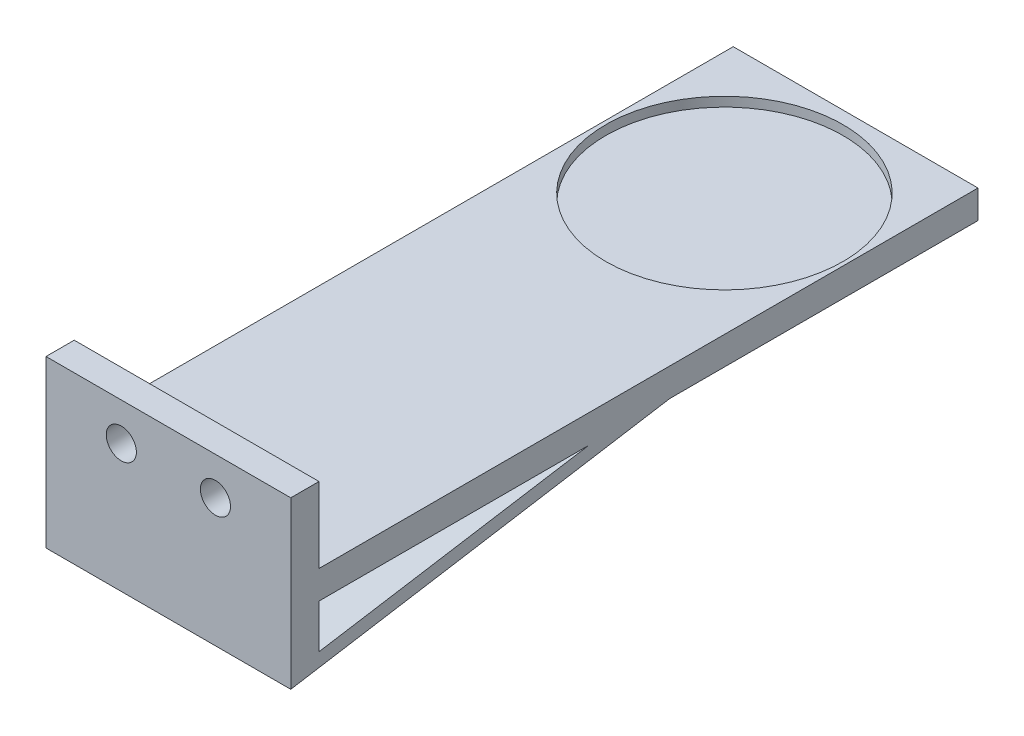
ISO-10303-21;
HEADER;
FILE_DESCRIPTION(('STEP AP214'),'2;1');
FILE_NAME('part.step','',(''),(''),'','','');
FILE_SCHEMA(('AUTOMOTIVE_DESIGN { 1 0 10303 214 1 1 1 1 }'));
ENDSEC;
DATA;
#1=APPLICATION_CONTEXT('core data for automotive mechanical design processes');
#2=APPLICATION_PROTOCOL_DEFINITION('international standard','automotive_design',2000,#1);
#3=PRODUCT_CONTEXT('',#1,'mechanical');
#4=PRODUCT('Part','Part','',(#3));
#5=PRODUCT_RELATED_PRODUCT_CATEGORY('part','',(#4));
#6=PRODUCT_DEFINITION_FORMATION('','',#4);
#7=PRODUCT_DEFINITION_CONTEXT('part definition',#1,'design');
#8=PRODUCT_DEFINITION('design','',#6,#7);
#9=PRODUCT_DEFINITION_SHAPE('','',#8);
#10=(LENGTH_UNIT() NAMED_UNIT(*) SI_UNIT(.MILLI.,.METRE.));
#11=(NAMED_UNIT(*) PLANE_ANGLE_UNIT() SI_UNIT($,.RADIAN.));
#12=(NAMED_UNIT(*) SI_UNIT($,.STERADIAN.) SOLID_ANGLE_UNIT());
#13=UNCERTAINTY_MEASURE_WITH_UNIT(LENGTH_MEASURE(1.E-05),#10,'distance_accuracy_value','');
#14=(GEOMETRIC_REPRESENTATION_CONTEXT(3) GLOBAL_UNCERTAINTY_ASSIGNED_CONTEXT((#13)) GLOBAL_UNIT_ASSIGNED_CONTEXT((#10,
#11,#12)) REPRESENTATION_CONTEXT('',''));
#15=CARTESIAN_POINT('',(0.,0.,0.));
#16=DIRECTION('',(0.,0.,1.));
#17=DIRECTION('',(1.,0.,0.));
#18=AXIS2_PLACEMENT_3D('',#15,#16,#17);
#19=CARTESIAN_POINT('',(26.,1.5,0.));
#20=DIRECTION('',(0.,1.,0.));
#21=DIRECTION('',(0.,0.,1.));
#22=AXIS2_PLACEMENT_3D('',#19,#20,#21);
#23=PLANE('',#22);
#24=CARTESIAN_POINT('',(13.,1.5,-22.5631650176297));
#25=DIRECTION('',(0.,1.,0.));
#26=DIRECTION('',(0.,0.,1.));
#27=AXIS2_PLACEMENT_3D('',#24,#25,#26);
#28=CIRCLE('',#27,12.6);
#29=CARTESIAN_POINT('',(13.,1.5,-9.96316501762967));
#30=VERTEX_POINT('',#29);
#31=EDGE_CURVE('E218',#30,#30,#28,.T.);
#32=ORIENTED_EDGE('',*,*,#31,.F.);
#33=EDGE_LOOP('',(#32));
#34=FACE_BOUND('',#33,.T.);
#35=DIRECTION('',(0.,0.,-1.));
#36=VECTOR('',#35,1.);
#37=CARTESIAN_POINT('',(0.,1.5,0.));
#38=LINE('',#37,#36);
#39=CARTESIAN_POINT('',(0.,1.5,33.5));
#40=VERTEX_POINT('',#39);
#41=CARTESIAN_POINT('',(0.,1.5,-36.5));
#42=VERTEX_POINT('',#41);
#43=EDGE_CURVE('E181',#40,#42,#38,.T.);
#44=ORIENTED_EDGE('',*,*,#43,.F.);
#45=DIRECTION('',(-1.,0.,0.));
#46=VECTOR('',#45,1.);
#47=CARTESIAN_POINT('',(26.,1.5,33.5));
#48=LINE('',#47,#46);
#49=CARTESIAN_POINT('',(26.,1.5,33.5));
#50=VERTEX_POINT('',#49);
#51=EDGE_CURVE('E11',#50,#40,#48,.T.);
#52=ORIENTED_EDGE('',*,*,#51,.F.);
#53=DIRECTION('',(0.,0.,-1.));
#54=VECTOR('',#53,1.);
#55=CARTESIAN_POINT('',(26.,1.5,0.));
#56=LINE('',#55,#54);
#57=CARTESIAN_POINT('',(26.,1.5,-36.5));
#58=VERTEX_POINT('',#57);
#59=EDGE_CURVE('E199',#50,#58,#56,.T.);
#60=ORIENTED_EDGE('',*,*,#59,.T.);
#61=DIRECTION('',(-1.,0.,0.));
#62=VECTOR('',#61,1.);
#63=CARTESIAN_POINT('',(26.,1.5,-36.5));
#64=LINE('',#63,#62);
#65=EDGE_CURVE('E98',#58,#42,#64,.T.);
#66=ORIENTED_EDGE('',*,*,#65,.T.);
#67=EDGE_LOOP('',(#44,#52,#60,#66));
#68=FACE_BOUND('',#67,.T.);
#69=ADVANCED_FACE('F39',(#34,#68),#23,.T.);
#70=CARTESIAN_POINT('',(26.,0.,33.5));
#71=DIRECTION('',(0.,0.,1.));
#72=DIRECTION('',(1.,0.,0.));
#73=AXIS2_PLACEMENT_3D('',#70,#71,#72);
#74=PLANE('',#73);
#75=CARTESIAN_POINT('',(18.,5.5,33.5));
#76=DIRECTION('',(0.,0.,1.));
#77=DIRECTION('',(1.,0.,0.));
#78=AXIS2_PLACEMENT_3D('',#75,#76,#77);
#79=CIRCLE('',#78,1.6);
#80=CARTESIAN_POINT('',(19.6,5.5,33.5));
#81=VERTEX_POINT('',#80);
#82=EDGE_CURVE('E211',#81,#81,#79,.T.);
#83=ORIENTED_EDGE('',*,*,#82,.T.);
#84=EDGE_LOOP('',(#83));
#85=FACE_BOUND('',#84,.T.);
#86=CARTESIAN_POINT('',(8.,5.5,33.5));
#87=DIRECTION('',(0.,0.,1.));
#88=DIRECTION('',(1.,0.,0.));
#89=AXIS2_PLACEMENT_3D('',#86,#87,#88);
#90=CIRCLE('',#89,1.6);
#91=CARTESIAN_POINT('',(9.6,5.5,33.5));
#92=VERTEX_POINT('',#91);
#93=EDGE_CURVE('E191',#92,#92,#90,.T.);
#94=ORIENTED_EDGE('',*,*,#93,.T.);
#95=EDGE_LOOP('',(#94));
#96=FACE_BOUND('',#95,.T.);
#97=DIRECTION('',(0.,1.,0.));
#98=VECTOR('',#97,1.);
#99=CARTESIAN_POINT('',(0.,0.,33.5));
#100=LINE('',#99,#98);
#101=CARTESIAN_POINT('',(0.,9.5,33.5));
#102=VERTEX_POINT('',#101);
#103=EDGE_CURVE('E178',#40,#102,#100,.T.);
#104=ORIENTED_EDGE('',*,*,#103,.T.);
#105=DIRECTION('',(-1.,0.,0.));
#106=VECTOR('',#105,1.);
#107=CARTESIAN_POINT('',(26.,9.5,33.5));
#108=LINE('',#107,#106);
#109=CARTESIAN_POINT('',(26.,9.5,33.5));
#110=VERTEX_POINT('',#109);
#111=EDGE_CURVE('E49',#110,#102,#108,.T.);
#112=ORIENTED_EDGE('',*,*,#111,.F.);
#113=DIRECTION('',(0.,1.,0.));
#114=VECTOR('',#113,1.);
#115=CARTESIAN_POINT('',(26.,0.,33.5));
#116=LINE('',#115,#114);
#117=EDGE_CURVE('E197',#50,#110,#116,.T.);
#118=ORIENTED_EDGE('',*,*,#117,.F.);
#119=ORIENTED_EDGE('',*,*,#51,.T.);
#120=EDGE_LOOP('',(#104,#112,#118,#119));
#121=FACE_BOUND('',#120,.T.);
#122=ADVANCED_FACE('F234',(#85,#96,#121),#74,.F.);
#123=CARTESIAN_POINT('',(26.,9.5,0.));
#124=DIRECTION('',(0.,1.,0.));
#125=DIRECTION('',(0.,0.,1.));
#126=AXIS2_PLACEMENT_3D('',#123,#124,#125);
#127=PLANE('',#126);
#128=DIRECTION('',(0.,0.,-1.));
#129=VECTOR('',#128,1.);
#130=CARTESIAN_POINT('',(0.,9.5,0.));
#131=LINE('',#130,#129);
#132=CARTESIAN_POINT('',(0.,9.5,36.5));
#133=VERTEX_POINT('',#132);
#134=EDGE_CURVE('E175',#133,#102,#131,.T.);
#135=ORIENTED_EDGE('',*,*,#134,.F.);
#136=DIRECTION('',(-1.,0.,0.));
#137=VECTOR('',#136,1.);
#138=CARTESIAN_POINT('',(26.,9.5,36.5));
#139=LINE('',#138,#137);
#140=CARTESIAN_POINT('',(26.,9.5,36.5));
#141=VERTEX_POINT('',#140);
#142=EDGE_CURVE('E150',#141,#133,#139,.T.);
#143=ORIENTED_EDGE('',*,*,#142,.F.);
#144=DIRECTION('',(0.,0.,-1.));
#145=VECTOR('',#144,1.);
#146=CARTESIAN_POINT('',(26.,9.5,0.));
#147=LINE('',#146,#145);
#148=EDGE_CURVE('E194',#141,#110,#147,.T.);
#149=ORIENTED_EDGE('',*,*,#148,.T.);
#150=ORIENTED_EDGE('',*,*,#111,.T.);
#151=EDGE_LOOP('',(#135,#143,#149,#150));
#152=FACE_BOUND('',#151,.T.);
#153=ADVANCED_FACE('F246',(#152),#127,.T.);
#154=CARTESIAN_POINT('',(26.,0.,36.5));
#155=DIRECTION('',(0.,0.,1.));
#156=DIRECTION('',(1.,0.,0.));
#157=AXIS2_PLACEMENT_3D('',#154,#155,#156);
#158=PLANE('',#157);
#159=CARTESIAN_POINT('',(18.,5.5,36.5));
#160=DIRECTION('',(0.,0.,1.));
#161=DIRECTION('',(1.,0.,0.));
#162=AXIS2_PLACEMENT_3D('',#159,#160,#161);
#163=CIRCLE('',#162,1.6);
#164=CARTESIAN_POINT('',(19.6,5.5,36.5));
#165=VERTEX_POINT('',#164);
#166=EDGE_CURVE('E214',#165,#165,#163,.T.);
#167=ORIENTED_EDGE('',*,*,#166,.F.);
#168=EDGE_LOOP('',(#167));
#169=FACE_BOUND('',#168,.T.);
#170=CARTESIAN_POINT('',(8.,5.5,36.5));
#171=DIRECTION('',(0.,0.,1.));
#172=DIRECTION('',(1.,0.,0.));
#173=AXIS2_PLACEMENT_3D('',#170,#171,#172);
#174=CIRCLE('',#173,1.6);
#175=CARTESIAN_POINT('',(9.6,5.5,36.5));
#176=VERTEX_POINT('',#175);
#177=EDGE_CURVE('E208',#176,#176,#174,.T.);
#178=ORIENTED_EDGE('',*,*,#177,.F.);
#179=EDGE_LOOP('',(#178));
#180=FACE_BOUND('',#179,.T.);
#181=DIRECTION('',(0.,1.,0.));
#182=VECTOR('',#181,1.);
#183=CARTESIAN_POINT('',(0.,0.,36.5));
#184=LINE('',#183,#182);
#185=CARTESIAN_POINT('',(0.,-8.11923054028458,36.5));
#186=VERTEX_POINT('',#185);
#187=EDGE_CURVE('E172',#186,#133,#184,.T.);
#188=ORIENTED_EDGE('',*,*,#187,.F.);
#189=DIRECTION('',(-1.,0.,0.));
#190=VECTOR('',#189,1.);
#191=CARTESIAN_POINT('',(26.,-8.11923054028458,36.5));
#192=LINE('',#191,#190);
#193=CARTESIAN_POINT('',(26.,-8.11923054028458,36.5));
#194=VERTEX_POINT('',#193);
#195=EDGE_CURVE('E148',#194,#186,#192,.T.);
#196=ORIENTED_EDGE('',*,*,#195,.F.);
#197=DIRECTION('',(0.,1.,0.));
#198=VECTOR('',#197,1.);
#199=CARTESIAN_POINT('',(26.,0.,36.5));
#200=LINE('',#199,#198);
#201=EDGE_CURVE('E142',#194,#141,#200,.T.);
#202=ORIENTED_EDGE('',*,*,#201,.T.);
#203=ORIENTED_EDGE('',*,*,#142,.T.);
#204=EDGE_LOOP('',(#188,#196,#202,#203));
#205=FACE_BOUND('',#204,.T.);
#206=ADVANCED_FACE('F245',(#169,#180,#205),#158,.T.);
#207=CARTESIAN_POINT('',(26.,-2.06173543457116,-0.339014290816787));
#208=DIRECTION('',(0.,0.986749243019688,0.162252677636062));
#209=DIRECTION('',(0.,-0.162252677636062,0.986749243019688));
#210=AXIS2_PLACEMENT_3D('',#207,#208,#209);
#211=PLANE('',#210);
#212=DIRECTION('',(0.,0.162252677636062,-0.986749243019688));
#213=VECTOR('',#212,1.);
#214=CARTESIAN_POINT('',(0.,-2.06173543457116,-0.339014290816787));
#215=LINE('',#214,#213);
#216=CARTESIAN_POINT('',(0.,-1.5,-3.75524151687046));
#217=VERTEX_POINT('',#216);
#218=EDGE_CURVE('E147',#186,#217,#215,.T.);
#219=ORIENTED_EDGE('',*,*,#218,.T.);
#220=DIRECTION('',(-1.,0.,0.));
#221=VECTOR('',#220,1.);
#222=CARTESIAN_POINT('',(26.,-1.5,-3.75524151687046));
#223=LINE('',#222,#221);
#224=CARTESIAN_POINT('',(26.,-1.5,-3.75524151687046));
#225=VERTEX_POINT('',#224);
#226=EDGE_CURVE('E132',#225,#217,#223,.T.);
#227=ORIENTED_EDGE('',*,*,#226,.F.);
#228=DIRECTION('',(0.,0.162252677636062,-0.986749243019688));
#229=VECTOR('',#228,1.);
#230=CARTESIAN_POINT('',(26.,-2.06173543457116,-0.339014290816787));
#231=LINE('',#230,#229);
#232=EDGE_CURVE('E135',#194,#225,#231,.T.);
#233=ORIENTED_EDGE('',*,*,#232,.F.);
#234=ORIENTED_EDGE('',*,*,#195,.T.);
#235=EDGE_LOOP('',(#219,#227,#233,#234));
#236=FACE_BOUND('',#235,.T.);
#237=ADVANCED_FACE('F145',(#236),#211,.F.);
#238=CARTESIAN_POINT('',(26.,-1.5,0.));
#239=DIRECTION('',(0.,1.,0.));
#240=DIRECTION('',(0.,0.,1.));
#241=AXIS2_PLACEMENT_3D('',#238,#239,#240);
#242=PLANE('',#241);
#243=DIRECTION('',(0.,0.,-1.));
#244=VECTOR('',#243,1.);
#245=CARTESIAN_POINT('',(0.,-1.5,0.));
#246=LINE('',#245,#244);
#247=CARTESIAN_POINT('',(0.,-1.5,-36.5));
#248=VERTEX_POINT('',#247);
#249=EDGE_CURVE('E169',#217,#248,#246,.T.);
#250=ORIENTED_EDGE('',*,*,#249,.T.);
#251=DIRECTION('',(-1.,0.,0.));
#252=VECTOR('',#251,1.);
#253=CARTESIAN_POINT('',(26.,-1.5,-36.5));
#254=LINE('',#253,#252);
#255=CARTESIAN_POINT('',(26.,-1.5,-36.5));
#256=VERTEX_POINT('',#255);
#257=EDGE_CURVE('E134',#256,#248,#254,.T.);
#258=ORIENTED_EDGE('',*,*,#257,.F.);
#259=DIRECTION('',(0.,0.,-1.));
#260=VECTOR('',#259,1.);
#261=CARTESIAN_POINT('',(26.,-1.5,0.));
#262=LINE('',#261,#260);
#263=EDGE_CURVE('E127',#225,#256,#262,.T.);
#264=ORIENTED_EDGE('',*,*,#263,.F.);
#265=ORIENTED_EDGE('',*,*,#226,.T.);
#266=EDGE_LOOP('',(#250,#258,#264,#265));
#267=FACE_BOUND('',#266,.T.);
#268=ADVANCED_FACE('F130',(#267),#242,.F.);
#269=CARTESIAN_POINT('',(26.,0.,33.5));
#270=DIRECTION('',(0.,0.,-1.));
#271=DIRECTION('',(-1.,0.,0.));
#272=AXIS2_PLACEMENT_3D('',#269,#270,#271);
#273=PLANE('',#272);
#274=DIRECTION('',(0.,-1.,0.));
#275=VECTOR('',#274,1.);
#276=CARTESIAN_POINT('',(0.,0.,33.5));
#277=LINE('',#276,#275);
#278=CARTESIAN_POINT('',(0.,-1.5,33.5));
#279=VERTEX_POINT('',#278);
#280=CARTESIAN_POINT('',(0.,-6.16041556328537,33.5));
#281=VERTEX_POINT('',#280);
#282=EDGE_CURVE('E188',#279,#281,#277,.T.);
#283=ORIENTED_EDGE('',*,*,#282,.F.);
#284=DIRECTION('',(-1.,0.,0.));
#285=VECTOR('',#284,1.);
#286=CARTESIAN_POINT('',(26.,-1.5,33.5));
#287=LINE('',#286,#285);
#288=CARTESIAN_POINT('',(26.,-1.5,33.5));
#289=VERTEX_POINT('',#288);
#290=EDGE_CURVE('E43',#289,#279,#287,.T.);
#291=ORIENTED_EDGE('',*,*,#290,.F.);
#292=DIRECTION('',(0.,-1.,0.));
#293=VECTOR('',#292,1.);
#294=CARTESIAN_POINT('',(26.,0.,33.5));
#295=LINE('',#294,#293);
#296=CARTESIAN_POINT('',(26.,-6.16041556328537,33.5));
#297=VERTEX_POINT('',#296);
#298=EDGE_CURVE('E168',#289,#297,#295,.T.);
#299=ORIENTED_EDGE('',*,*,#298,.T.);
#300=DIRECTION('',(-1.,0.,0.));
#301=VECTOR('',#300,1.);
#302=CARTESIAN_POINT('',(26.,-6.16041556328537,33.5));
#303=LINE('',#302,#301);
#304=EDGE_CURVE('E157',#297,#281,#303,.T.);
#305=ORIENTED_EDGE('',*,*,#304,.T.);
#306=EDGE_LOOP('',(#283,#291,#299,#305));
#307=FACE_BOUND('',#306,.T.);
#308=ADVANCED_FACE('F41',(#307),#273,.T.);
#309=CARTESIAN_POINT('',(26.,-1.5,0.));
#310=DIRECTION('',(0.,1.,0.));
#311=DIRECTION('',(0.,0.,1.));
#312=AXIS2_PLACEMENT_3D('',#309,#310,#311);
#313=PLANE('',#312);
#314=DIRECTION('',(0.,0.,-1.));
#315=VECTOR('',#314,1.);
#316=CARTESIAN_POINT('',(0.,-1.5,0.));
#317=LINE('',#316,#315);
#318=CARTESIAN_POINT('',(0.,-1.5,4.86111965376068));
#319=VERTEX_POINT('',#318);
#320=EDGE_CURVE('E186',#279,#319,#317,.T.);
#321=ORIENTED_EDGE('',*,*,#320,.T.);
#322=DIRECTION('',(-1.,0.,0.));
#323=VECTOR('',#322,1.);
#324=CARTESIAN_POINT('',(26.,-1.5,4.86111965376068));
#325=LINE('',#324,#323);
#326=CARTESIAN_POINT('',(26.,-1.5,4.86111965376068));
#327=VERTEX_POINT('',#326);
#328=EDGE_CURVE('E158',#327,#319,#325,.T.);
#329=ORIENTED_EDGE('',*,*,#328,.F.);
#330=DIRECTION('',(0.,0.,-1.));
#331=VECTOR('',#330,1.);
#332=CARTESIAN_POINT('',(26.,-1.5,0.));
#333=LINE('',#332,#331);
#334=EDGE_CURVE('E203',#289,#327,#333,.T.);
#335=ORIENTED_EDGE('',*,*,#334,.F.);
#336=ORIENTED_EDGE('',*,*,#290,.T.);
#337=EDGE_LOOP('',(#321,#329,#335,#336));
#338=FACE_BOUND('',#337,.T.);
#339=ADVANCED_FACE('F262',(#338),#313,.F.);
#340=CARTESIAN_POINT('',(26.,-0.690658751675982,-0.11239115343602));
#341=DIRECTION('',(0.,0.987016711430102,0.160617593549729));
#342=DIRECTION('',(0.,-0.160617593549729,0.987016711430103));
#343=AXIS2_PLACEMENT_3D('',#340,#341,#342);
#344=PLANE('',#343);
#345=DIRECTION('',(0.,0.160617593549729,-0.987016711430102));
#346=VECTOR('',#345,1.);
#347=CARTESIAN_POINT('',(0.,-0.690658751675982,-0.11239115343602));
#348=LINE('',#347,#346);
#349=EDGE_CURVE('E183',#281,#319,#348,.T.);
#350=ORIENTED_EDGE('',*,*,#349,.F.);
#351=ORIENTED_EDGE('',*,*,#304,.F.);
#352=DIRECTION('',(0.,0.160617593549729,-0.987016711430102));
#353=VECTOR('',#352,1.);
#354=CARTESIAN_POINT('',(26.,-0.690658751675982,-0.11239115343602));
#355=LINE('',#354,#353);
#356=EDGE_CURVE('E201',#297,#327,#355,.T.);
#357=ORIENTED_EDGE('',*,*,#356,.T.);
#358=ORIENTED_EDGE('',*,*,#328,.T.);
#359=EDGE_LOOP('',(#350,#351,#357,#358));
#360=FACE_BOUND('',#359,.T.);
#361=ADVANCED_FACE('F259',(#360),#344,.T.);
#362=CARTESIAN_POINT('',(26.,0.,-36.5));
#363=DIRECTION('',(0.,0.,1.));
#364=DIRECTION('',(1.,0.,0.));
#365=AXIS2_PLACEMENT_3D('',#362,#363,#364);
#366=PLANE('',#365);
#367=DIRECTION('',(0.,1.,0.));
#368=VECTOR('',#367,1.);
#369=CARTESIAN_POINT('',(0.,0.,-36.5));
#370=LINE('',#369,#368);
#371=EDGE_CURVE('E91',#248,#42,#370,.T.);
#372=ORIENTED_EDGE('',*,*,#371,.T.);
#373=ORIENTED_EDGE('',*,*,#65,.F.);
#374=DIRECTION('',(0.,1.,0.));
#375=VECTOR('',#374,1.);
#376=CARTESIAN_POINT('',(26.,0.,-36.5));
#377=LINE('',#376,#375);
#378=EDGE_CURVE('E58',#256,#58,#377,.T.);
#379=ORIENTED_EDGE('',*,*,#378,.F.);
#380=ORIENTED_EDGE('',*,*,#257,.T.);
#381=EDGE_LOOP('',(#372,#373,#379,#380));
#382=FACE_BOUND('',#381,.T.);
#383=ADVANCED_FACE('F261',(#382),#366,.F.);
#384=CARTESIAN_POINT('',(26.,0.,0.));
#385=DIRECTION('',(1.,0.,0.));
#386=DIRECTION('',(0.,0.,-1.));
#387=AXIS2_PLACEMENT_3D('',#384,#385,#386);
#388=PLANE('',#387);
#389=ORIENTED_EDGE('',*,*,#298,.F.);
#390=ORIENTED_EDGE('',*,*,#334,.T.);
#391=ORIENTED_EDGE('',*,*,#356,.F.);
#392=EDGE_LOOP('',(#389,#390,#391));
#393=FACE_BOUND('',#392,.T.);
#394=ORIENTED_EDGE('',*,*,#59,.F.);
#395=ORIENTED_EDGE('',*,*,#117,.T.);
#396=ORIENTED_EDGE('',*,*,#148,.F.);
#397=ORIENTED_EDGE('',*,*,#201,.F.);
#398=ORIENTED_EDGE('',*,*,#232,.T.);
#399=ORIENTED_EDGE('',*,*,#263,.T.);
#400=ORIENTED_EDGE('',*,*,#378,.T.);
#401=EDGE_LOOP('',(#394,#395,#396,#397,#398,#399,#400));
#402=FACE_BOUND('',#401,.T.);
#403=ADVANCED_FACE('F139',(#393,#402),#388,.T.);
#404=CARTESIAN_POINT('',(0.,0.,0.));
#405=DIRECTION('',(1.,0.,0.));
#406=DIRECTION('',(0.,0.,-1.));
#407=AXIS2_PLACEMENT_3D('',#404,#405,#406);
#408=PLANE('',#407);
#409=ORIENTED_EDGE('',*,*,#282,.T.);
#410=ORIENTED_EDGE('',*,*,#349,.T.);
#411=ORIENTED_EDGE('',*,*,#320,.F.);
#412=EDGE_LOOP('',(#409,#410,#411));
#413=FACE_BOUND('',#412,.T.);
#414=ORIENTED_EDGE('',*,*,#43,.T.);
#415=ORIENTED_EDGE('',*,*,#371,.F.);
#416=ORIENTED_EDGE('',*,*,#249,.F.);
#417=ORIENTED_EDGE('',*,*,#218,.F.);
#418=ORIENTED_EDGE('',*,*,#187,.T.);
#419=ORIENTED_EDGE('',*,*,#134,.T.);
#420=ORIENTED_EDGE('',*,*,#103,.F.);
#421=EDGE_LOOP('',(#414,#415,#416,#417,#418,#419,#420));
#422=FACE_BOUND('',#421,.T.);
#423=ADVANCED_FACE('F238',(#413,#422),#408,.F.);
#424=CARTESIAN_POINT('',(8.,5.5,26.5));
#425=DIRECTION('',(0.,0.,1.));
#426=DIRECTION('',(1.,0.,0.));
#427=AXIS2_PLACEMENT_3D('',#424,#425,#426);
#428=CYLINDRICAL_SURFACE('',#427,1.6);
#429=ORIENTED_EDGE('',*,*,#177,.T.);
#430=EDGE_LOOP('',(#429));
#431=FACE_BOUND('',#430,.T.);
#432=ORIENTED_EDGE('',*,*,#93,.F.);
#433=EDGE_LOOP('',(#432));
#434=FACE_BOUND('',#433,.T.);
#435=ADVANCED_FACE('F277',(#431,#434),#428,.F.);
#436=CARTESIAN_POINT('',(18.,5.5,26.5));
#437=DIRECTION('',(0.,0.,1.));
#438=DIRECTION('',(1.,0.,0.));
#439=AXIS2_PLACEMENT_3D('',#436,#437,#438);
#440=CYLINDRICAL_SURFACE('',#439,1.6);
#441=ORIENTED_EDGE('',*,*,#166,.T.);
#442=EDGE_LOOP('',(#441));
#443=FACE_BOUND('',#442,.T.);
#444=ORIENTED_EDGE('',*,*,#82,.F.);
#445=EDGE_LOOP('',(#444));
#446=FACE_BOUND('',#445,.T.);
#447=ADVANCED_FACE('F229',(#443,#446),#440,.F.);
#448=CARTESIAN_POINT('',(13.,0.5,-22.5631650176297));
#449=DIRECTION('',(0.,1.,0.));
#450=DIRECTION('',(0.,0.,1.));
#451=AXIS2_PLACEMENT_3D('',#448,#449,#450);
#452=CYLINDRICAL_SURFACE('',#451,12.6);
#453=CARTESIAN_POINT('',(13.,0.5,-22.5631650176297));
#454=DIRECTION('',(0.,1.,0.));
#455=DIRECTION('',(0.,0.,1.));
#456=AXIS2_PLACEMENT_3D('',#453,#454,#455);
#457=CIRCLE('',#456,12.6);
#458=CARTESIAN_POINT('',(13.,0.5,-9.96316501762967));
#459=VERTEX_POINT('',#458);
#460=EDGE_CURVE('E217',#459,#459,#457,.T.);
#461=ORIENTED_EDGE('',*,*,#460,.F.);
#462=EDGE_LOOP('',(#461));
#463=FACE_BOUND('',#462,.T.);
#464=ORIENTED_EDGE('',*,*,#31,.T.);
#465=EDGE_LOOP('',(#464));
#466=FACE_BOUND('',#465,.T.);
#467=ADVANCED_FACE('F226',(#463,#466),#452,.F.);
#468=CARTESIAN_POINT('',(13.,0.5,-22.5631650176297));
#469=DIRECTION('',(0.,1.,0.));
#470=DIRECTION('',(0.,0.,1.));
#471=AXIS2_PLACEMENT_3D('',#468,#469,#470);
#472=PLANE('',#471);
#473=ORIENTED_EDGE('',*,*,#460,.T.);
#474=EDGE_LOOP('',(#473));
#475=FACE_BOUND('',#474,.T.);
#476=ADVANCED_FACE('F224',(#475),#472,.T.);
#477=CLOSED_SHELL('',(#69,#122,#153,#206,#237,#268,#308,#339,#361,#383,#403,#423,#435,#447,#467,#476));
#478=MANIFOLD_SOLID_BREP('B2',#477);
#479=ADVANCED_BREP_SHAPE_REPRESENTATION('',(#18,#478),#14);
#480=SHAPE_DEFINITION_REPRESENTATION(#9,#479);
ENDSEC;
END-ISO-10303-21;
